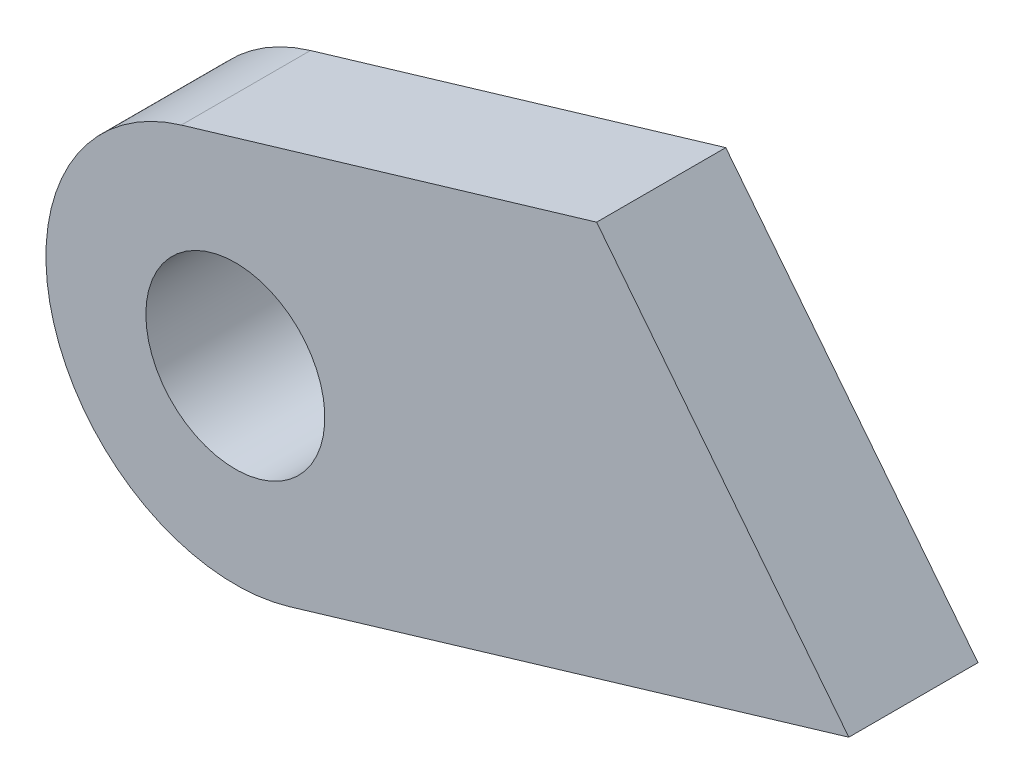
ISO-10303-21;
HEADER;
FILE_DESCRIPTION(('STEP AP214'),'2;1');
FILE_NAME('part.step','',(''),(''),'','','');
FILE_SCHEMA(('AUTOMOTIVE_DESIGN { 1 0 10303 214 1 1 1 1 }'));
ENDSEC;
DATA;
#1=APPLICATION_CONTEXT('core data for automotive mechanical design processes');
#2=APPLICATION_PROTOCOL_DEFINITION('international standard','automotive_design',2000,#1);
#3=PRODUCT_CONTEXT('',#1,'mechanical');
#4=PRODUCT('Part','Part','',(#3));
#5=PRODUCT_RELATED_PRODUCT_CATEGORY('part','',(#4));
#6=PRODUCT_DEFINITION_FORMATION('','',#4);
#7=PRODUCT_DEFINITION_CONTEXT('part definition',#1,'design');
#8=PRODUCT_DEFINITION('design','',#6,#7);
#9=PRODUCT_DEFINITION_SHAPE('','',#8);
#10=(LENGTH_UNIT() NAMED_UNIT(*) SI_UNIT(.MILLI.,.METRE.));
#11=(NAMED_UNIT(*) PLANE_ANGLE_UNIT() SI_UNIT($,.RADIAN.));
#12=(NAMED_UNIT(*) SI_UNIT($,.STERADIAN.) SOLID_ANGLE_UNIT());
#13=UNCERTAINTY_MEASURE_WITH_UNIT(LENGTH_MEASURE(1.E-05),#10,'distance_accuracy_value','');
#14=(GEOMETRIC_REPRESENTATION_CONTEXT(3) GLOBAL_UNCERTAINTY_ASSIGNED_CONTEXT((#13)) GLOBAL_UNIT_ASSIGNED_CONTEXT((#10,
#11,#12)) REPRESENTATION_CONTEXT('',''));
#15=CARTESIAN_POINT('',(0.,0.,0.));
#16=DIRECTION('',(0.,0.,1.));
#17=DIRECTION('',(1.,0.,0.));
#18=AXIS2_PLACEMENT_3D('',#15,#16,#17);
#19=CARTESIAN_POINT('',(-510.286,-88.9,4.7625));
#20=DIRECTION('',(0.,0.,-1.));
#21=DIRECTION('',(-1.,0.,0.));
#22=AXIS2_PLACEMENT_3D('',#19,#20,#21);
#23=PLANE('',#22);
#24=CARTESIAN_POINT('',(-510.286,-88.9,4.7625));
#25=DIRECTION('',(0.,0.,1.));
#26=DIRECTION('',(-1.,0.,0.));
#27=AXIS2_PLACEMENT_3D('',#24,#25,#26);
#28=CIRCLE('',#27,6.98499999999999);
#29=CARTESIAN_POINT('',(-512.277542982367,-82.204928562787,4.7625));
#30=VERTEX_POINT('',#29);
#31=CARTESIAN_POINT('',(-508.291723206054,-95.5942576189694,4.7625));
#32=VERTEX_POINT('',#31);
#33=EDGE_CURVE('E85',#30,#32,#28,.T.);
#34=ORIENTED_EDGE('',*,*,#33,.T.);
#35=DIRECTION('',(0.958376180238997,0.285508488753854,0.));
#36=VECTOR('',#35,1.);
#37=CARTESIAN_POINT('',(-508.291723206054,-95.5942576189694,4.7625));
#38=LINE('',#37,#36);
#39=CARTESIAN_POINT('',(-487.660025710535,-89.4478978764896,4.7625));
#40=VERTEX_POINT('',#39);
#41=EDGE_CURVE('E80',#32,#40,#38,.T.);
#42=ORIENTED_EDGE('',*,*,#41,.T.);
#43=DIRECTION('',(-0.619138375684544,0.785281905913223,0.));
#44=VECTOR('',#43,1.);
#45=CARTESIAN_POINT('',(-487.660025710535,-89.4478978764896,4.7625));
#46=LINE('',#45,#44);
#47=CARTESIAN_POINT('',(-496.962426185818,-77.6492320827215,4.7625));
#48=VERTEX_POINT('',#47);
#49=EDGE_CURVE('E83',#40,#48,#46,.T.);
#50=ORIENTED_EDGE('',*,*,#49,.T.);
#51=DIRECTION('',(-0.958492689651104,-0.28511710556435,0.));
#52=VECTOR('',#51,1.);
#53=CARTESIAN_POINT('',(-512.277542982367,-82.204928562787,4.7625));
#54=LINE('',#53,#52);
#55=EDGE_CURVE('E50',#48,#30,#54,.T.);
#56=ORIENTED_EDGE('',*,*,#55,.T.);
#57=EDGE_LOOP('',(#34,#42,#50,#56));
#58=FACE_BOUND('',#57,.T.);
#59=CARTESIAN_POINT('',(-510.286,-88.9,4.7625));
#60=DIRECTION('',(0.,0.,1.));
#61=DIRECTION('',(1.,0.,0.));
#62=AXIS2_PLACEMENT_3D('',#59,#60,#61);
#63=CIRCLE('',#62,3.29999999999998);
#64=CARTESIAN_POINT('',(-513.586,-88.9,4.7625));
#65=VERTEX_POINT('',#64);
#66=EDGE_CURVE('E100',#65,#65,#63,.T.);
#67=ORIENTED_EDGE('',*,*,#66,.F.);
#68=EDGE_LOOP('',(#67));
#69=FACE_BOUND('',#68,.T.);
#70=ADVANCED_FACE('F33',(#58,#69),#23,.F.);
#71=CARTESIAN_POINT('',(-510.286,-88.9,0.));
#72=DIRECTION('',(0.,0.,-1.));
#73=DIRECTION('',(-1.,0.,0.));
#74=AXIS2_PLACEMENT_3D('',#71,#72,#73);
#75=PLANE('',#74);
#76=CARTESIAN_POINT('',(-510.286,-88.9,0.));
#77=DIRECTION('',(0.,0.,1.));
#78=DIRECTION('',(-1.,0.,0.));
#79=AXIS2_PLACEMENT_3D('',#76,#77,#78);
#80=CIRCLE('',#79,6.98499999999999);
#81=CARTESIAN_POINT('',(-512.277542982367,-82.204928562787,0.));
#82=VERTEX_POINT('',#81);
#83=CARTESIAN_POINT('',(-508.291723206054,-95.5942576189694,0.));
#84=VERTEX_POINT('',#83);
#85=EDGE_CURVE('E97',#82,#84,#80,.T.);
#86=ORIENTED_EDGE('',*,*,#85,.F.);
#87=DIRECTION('',(-0.958492689651104,-0.28511710556435,0.));
#88=VECTOR('',#87,1.);
#89=CARTESIAN_POINT('',(-512.277542982367,-82.204928562787,0.));
#90=LINE('',#89,#88);
#91=CARTESIAN_POINT('',(-496.962426185818,-77.6492320827215,0.));
#92=VERTEX_POINT('',#91);
#93=EDGE_CURVE('E73',#92,#82,#90,.T.);
#94=ORIENTED_EDGE('',*,*,#93,.F.);
#95=DIRECTION('',(-0.619138375684544,0.785281905913223,0.));
#96=VECTOR('',#95,1.);
#97=CARTESIAN_POINT('',(-487.660025710535,-89.4478978764896,0.));
#98=LINE('',#97,#96);
#99=CARTESIAN_POINT('',(-487.660025710535,-89.4478978764896,0.));
#100=VERTEX_POINT('',#99);
#101=EDGE_CURVE('E67',#100,#92,#98,.T.);
#102=ORIENTED_EDGE('',*,*,#101,.F.);
#103=DIRECTION('',(0.958376180238997,0.285508488753854,0.));
#104=VECTOR('',#103,1.);
#105=CARTESIAN_POINT('',(-508.291723206054,-95.5942576189694,0.));
#106=LINE('',#105,#104);
#107=EDGE_CURVE('E89',#84,#100,#106,.T.);
#108=ORIENTED_EDGE('',*,*,#107,.F.);
#109=EDGE_LOOP('',(#86,#94,#102,#108));
#110=FACE_BOUND('',#109,.T.);
#111=CARTESIAN_POINT('',(-510.286,-88.9,0.));
#112=DIRECTION('',(0.,0.,1.));
#113=DIRECTION('',(1.,0.,0.));
#114=AXIS2_PLACEMENT_3D('',#111,#112,#113);
#115=CIRCLE('',#114,3.29999999999998);
#116=CARTESIAN_POINT('',(-513.586,-88.9,0.));
#117=VERTEX_POINT('',#116);
#118=EDGE_CURVE('E112',#117,#117,#115,.T.);
#119=ORIENTED_EDGE('',*,*,#118,.T.);
#120=EDGE_LOOP('',(#119));
#121=FACE_BOUND('',#120,.T.);
#122=ADVANCED_FACE('F108',(#110,#121),#75,.T.);
#123=CARTESIAN_POINT('',(-510.286,-88.9,4.7625));
#124=DIRECTION('',(0.,0.,-1.));
#125=DIRECTION('',(-1.,0.,0.));
#126=AXIS2_PLACEMENT_3D('',#123,#124,#125);
#127=CYLINDRICAL_SURFACE('',#126,6.98499999999999);
#128=ORIENTED_EDGE('',*,*,#85,.T.);
#129=DIRECTION('',(0.,0.,-1.));
#130=VECTOR('',#129,1.);
#131=CARTESIAN_POINT('',(-508.291723206054,-95.5942576189694,4.7625));
#132=LINE('',#131,#130);
#133=EDGE_CURVE('E11',#32,#84,#132,.T.);
#134=ORIENTED_EDGE('',*,*,#133,.F.);
#135=ORIENTED_EDGE('',*,*,#33,.F.);
#136=DIRECTION('',(0.,0.,-1.));
#137=VECTOR('',#136,1.);
#138=CARTESIAN_POINT('',(-512.277542982367,-82.204928562787,4.7625));
#139=LINE('',#138,#137);
#140=EDGE_CURVE('E93',#30,#82,#139,.T.);
#141=ORIENTED_EDGE('',*,*,#140,.T.);
#142=EDGE_LOOP('',(#128,#134,#135,#141));
#143=FACE_BOUND('',#142,.T.);
#144=ADVANCED_FACE('F35',(#143),#127,.T.);
#145=CARTESIAN_POINT('',(-508.291723206054,-95.5942576189694,4.7625));
#146=DIRECTION('',(-0.285508488753854,0.958376180238997,0.));
#147=DIRECTION('',(-0.958376180238997,-0.285508488753854,0.));
#148=AXIS2_PLACEMENT_3D('',#145,#146,#147);
#149=PLANE('',#148);
#150=ORIENTED_EDGE('',*,*,#107,.T.);
#151=DIRECTION('',(0.,0.,-1.));
#152=VECTOR('',#151,1.);
#153=CARTESIAN_POINT('',(-487.660025710535,-89.4478978764896,4.7625));
#154=LINE('',#153,#152);
#155=EDGE_CURVE('E42',#40,#100,#154,.T.);
#156=ORIENTED_EDGE('',*,*,#155,.F.);
#157=ORIENTED_EDGE('',*,*,#41,.F.);
#158=ORIENTED_EDGE('',*,*,#133,.T.);
#159=EDGE_LOOP('',(#150,#156,#157,#158));
#160=FACE_BOUND('',#159,.T.);
#161=ADVANCED_FACE('F88',(#160),#149,.F.);
#162=CARTESIAN_POINT('',(-487.660025710535,-89.4478978764896,4.7625));
#163=DIRECTION('',(-0.785281905913224,-0.619138375684544,0.));
#164=DIRECTION('',(0.619138375684544,-0.785281905913223,0.));
#165=AXIS2_PLACEMENT_3D('',#162,#163,#164);
#166=PLANE('',#165);
#167=ORIENTED_EDGE('',*,*,#101,.T.);
#168=DIRECTION('',(0.,0.,-1.));
#169=VECTOR('',#168,1.);
#170=CARTESIAN_POINT('',(-496.962426185818,-77.6492320827215,4.7625));
#171=LINE('',#170,#169);
#172=EDGE_CURVE('E90',#48,#92,#171,.T.);
#173=ORIENTED_EDGE('',*,*,#172,.F.);
#174=ORIENTED_EDGE('',*,*,#49,.F.);
#175=ORIENTED_EDGE('',*,*,#155,.T.);
#176=EDGE_LOOP('',(#167,#173,#174,#175));
#177=FACE_BOUND('',#176,.T.);
#178=ADVANCED_FACE('F91',(#177),#166,.F.);
#179=CARTESIAN_POINT('',(-512.277542982367,-82.204928562787,4.7625));
#180=DIRECTION('',(0.28511710556435,-0.958492689651104,0.));
#181=DIRECTION('',(0.958492689651104,0.28511710556435,0.));
#182=AXIS2_PLACEMENT_3D('',#179,#180,#181);
#183=PLANE('',#182);
#184=ORIENTED_EDGE('',*,*,#93,.T.);
#185=ORIENTED_EDGE('',*,*,#140,.F.);
#186=ORIENTED_EDGE('',*,*,#55,.F.);
#187=ORIENTED_EDGE('',*,*,#172,.T.);
#188=EDGE_LOOP('',(#184,#185,#186,#187));
#189=FACE_BOUND('',#188,.T.);
#190=ADVANCED_FACE('F105',(#189),#183,.F.);
#191=CARTESIAN_POINT('',(-510.286,-88.9,4.7625));
#192=DIRECTION('',(0.,0.,-1.));
#193=DIRECTION('',(-1.,0.,0.));
#194=AXIS2_PLACEMENT_3D('',#191,#192,#193);
#195=CYLINDRICAL_SURFACE('',#194,3.29999999999998);
#196=CARTESIAN_POINT('',(-513.586,-88.9,4.7625));
#197=CARTESIAN_POINT('',(-513.586,-88.9,4.712890625));
#198=CARTESIAN_POINT('',(-513.586,-88.9,4.66328125));
#199=CARTESIAN_POINT('',(-513.586,-88.9,4.5640625));
#200=CARTESIAN_POINT('',(-513.586,-88.9,4.514453125));
#201=CARTESIAN_POINT('',(-513.586,-88.9,4.415234375));
#202=CARTESIAN_POINT('',(-513.586,-88.9,4.365625));
#203=CARTESIAN_POINT('',(-513.586,-88.9,4.26640625));
#204=CARTESIAN_POINT('',(-513.586,-88.9,4.216796875));
#205=CARTESIAN_POINT('',(-513.586,-88.9,4.117578125));
#206=CARTESIAN_POINT('',(-513.586,-88.9,4.06796875));
#207=CARTESIAN_POINT('',(-513.586,-88.9,3.96875));
#208=CARTESIAN_POINT('',(-513.586,-88.9,3.919140625));
#209=CARTESIAN_POINT('',(-513.586,-88.9,3.819921875));
#210=CARTESIAN_POINT('',(-513.586,-88.9,3.7703125));
#211=CARTESIAN_POINT('',(-513.586,-88.9,3.67109375));
#212=CARTESIAN_POINT('',(-513.586,-88.9,3.621484375));
#213=CARTESIAN_POINT('',(-513.586,-88.9,3.522265625));
#214=CARTESIAN_POINT('',(-513.586,-88.9,3.47265625));
#215=CARTESIAN_POINT('',(-513.586,-88.9,3.3734375));
#216=CARTESIAN_POINT('',(-513.586,-88.9,3.323828125));
#217=CARTESIAN_POINT('',(-513.586,-88.9,3.224609375));
#218=CARTESIAN_POINT('',(-513.586,-88.9,3.175));
#219=CARTESIAN_POINT('',(-513.586,-88.9,3.07578125));
#220=CARTESIAN_POINT('',(-513.586,-88.9,3.026171875));
#221=CARTESIAN_POINT('',(-513.586,-88.9,2.926953125));
#222=CARTESIAN_POINT('',(-513.586,-88.9,2.87734375));
#223=CARTESIAN_POINT('',(-513.586,-88.9,2.778125));
#224=CARTESIAN_POINT('',(-513.586,-88.9,2.728515625));
#225=CARTESIAN_POINT('',(-513.586,-88.9,2.629296875));
#226=CARTESIAN_POINT('',(-513.586,-88.9,2.5796875));
#227=CARTESIAN_POINT('',(-513.586,-88.9,2.48046875));
#228=CARTESIAN_POINT('',(-513.586,-88.9,2.430859375));
#229=CARTESIAN_POINT('',(-513.586,-88.9,2.331640625));
#230=CARTESIAN_POINT('',(-513.586,-88.9,2.28203125));
#231=CARTESIAN_POINT('',(-513.586,-88.9,2.1828125));
#232=CARTESIAN_POINT('',(-513.586,-88.9,2.133203125));
#233=CARTESIAN_POINT('',(-513.586,-88.9,2.033984375));
#234=CARTESIAN_POINT('',(-513.586,-88.9,1.984375));
#235=CARTESIAN_POINT('',(-513.586,-88.9,1.88515625));
#236=CARTESIAN_POINT('',(-513.586,-88.9,1.835546875));
#237=CARTESIAN_POINT('',(-513.586,-88.9,1.736328125));
#238=CARTESIAN_POINT('',(-513.586,-88.9,1.68671875));
#239=CARTESIAN_POINT('',(-513.586,-88.9,1.5875));
#240=CARTESIAN_POINT('',(-513.586,-88.9,1.537890625));
#241=CARTESIAN_POINT('',(-513.586,-88.9,1.438671875));
#242=CARTESIAN_POINT('',(-513.586,-88.9,1.3890625));
#243=CARTESIAN_POINT('',(-513.586,-88.9,1.28984375));
#244=CARTESIAN_POINT('',(-513.586,-88.9,1.240234375));
#245=CARTESIAN_POINT('',(-513.586,-88.9,1.141015625));
#246=CARTESIAN_POINT('',(-513.586,-88.9,1.09140625));
#247=CARTESIAN_POINT('',(-513.586,-88.9,0.992187499999999));
#248=CARTESIAN_POINT('',(-513.586,-88.9,0.942578124999999));
#249=CARTESIAN_POINT('',(-513.586,-88.9,0.843359375));
#250=CARTESIAN_POINT('',(-513.586,-88.9,0.79375));
#251=CARTESIAN_POINT('',(-513.586,-88.9,0.69453125));
#252=CARTESIAN_POINT('',(-513.586,-88.9,0.644921875));
#253=CARTESIAN_POINT('',(-513.586,-88.9,0.545703125));
#254=CARTESIAN_POINT('',(-513.586,-88.9,0.49609375));
#255=CARTESIAN_POINT('',(-513.586,-88.9,0.396875));
#256=CARTESIAN_POINT('',(-513.586,-88.9,0.347265625));
#257=CARTESIAN_POINT('',(-513.586,-88.9,0.248046875));
#258=CARTESIAN_POINT('',(-513.586,-88.9,0.1984375));
#259=CARTESIAN_POINT('',(-513.586,-88.9,0.09921875));
#260=CARTESIAN_POINT('',(-513.586,-88.9,0.049609375));
#261=CARTESIAN_POINT('',(-513.586,-88.9,0.));
#262=B_SPLINE_CURVE_WITH_KNOTS('',3,(#196,#197,#198,#199,#200,#201,#202,#203,#204,#205,#206,
#207,#208,#209,#210,#211,#212,#213,#214,#215,#216,#217,#218,#219,#220,#221,#222,#223,#224,#225,
#226,#227,#228,#229,#230,#231,#232,#233,#234,#235,#236,#237,#238,#239,#240,#241,#242,#243,#244,
#245,#246,#247,#248,#249,#250,#251,#252,#253,#254,#255,#256,#257,#258,#259,#260,#261),
.UNSPECIFIED.,.F.,.F.,(4,2,2,2,2,2,2,2,2,2,2,2,2,2,2,2,2,2,2,2,2,2,2,2,2,2,2,2,2,2,2,2,4),(0.,
0.148828125,0.29765625,0.446484375,0.5953125,0.744140625,0.892968750000001,1.041796875,1.190625,
1.339453125,1.48828125,1.637109375,1.7859375,1.934765625,2.08359375,2.232421875,2.38125,
2.530078125,2.67890625,2.827734375,2.9765625,3.125390625,3.27421875,3.423046875,3.571875,
3.720703125,3.86953125,4.018359375,4.1671875,4.316015625,4.46484375,4.613671875,4.7625),.UNSPECIFIED.);
#263=EDGE_CURVE('BSEAM118',#65,#117,#262,.T.);
#264=ORIENTED_EDGE('',*,*,#66,.T.);
#265=ORIENTED_EDGE('',*,*,#118,.F.);
#266=ORIENTED_EDGE('',*,*,#263,.T.);
#267=ORIENTED_EDGE('',*,*,#263,.F.);
#268=EDGE_LOOP('',(#264,#266,#265,#267));
#269=FACE_BOUND('',#268,.T.);
#270=ADVANCED_FACE('F118',(#269),#195,.F.);
#271=CLOSED_SHELL('',(#70,#122,#144,#161,#178,#190,#270));
#272=MANIFOLD_SOLID_BREP('B2',#271);
#273=ADVANCED_BREP_SHAPE_REPRESENTATION('',(#18,#272),#14);
#274=SHAPE_DEFINITION_REPRESENTATION(#9,#273);
ENDSEC;
END-ISO-10303-21;
